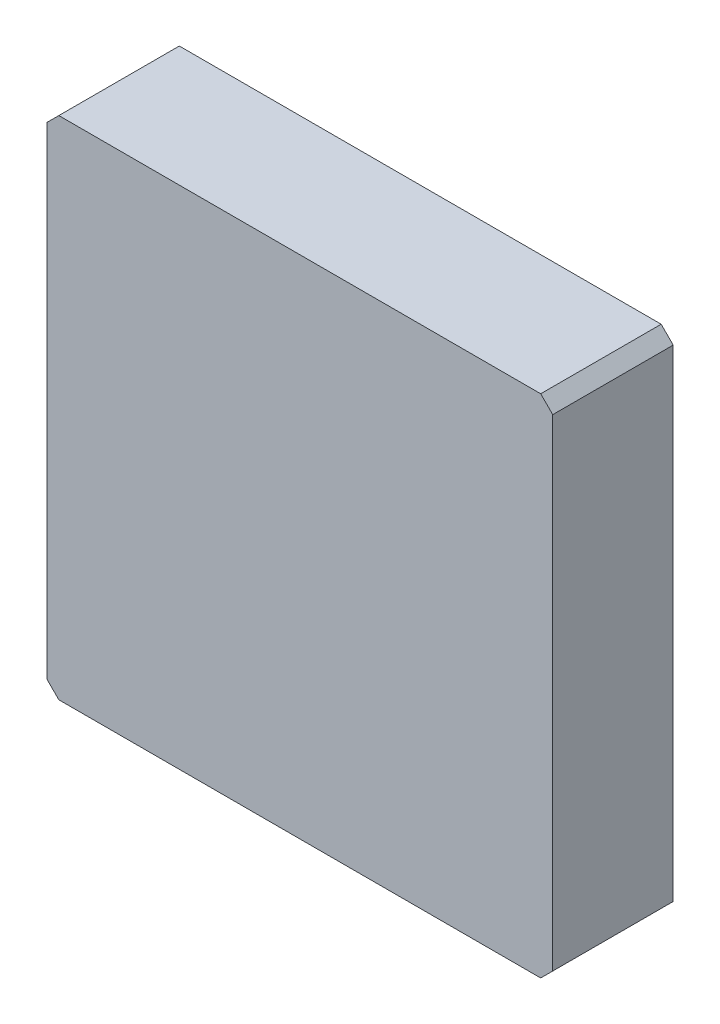
ISO-10303-21;
HEADER;
FILE_DESCRIPTION(('STEP AP214'),'2;1');
FILE_NAME('part.step','',(''),(''),'','','');
FILE_SCHEMA(('AUTOMOTIVE_DESIGN { 1 0 10303 214 1 1 1 1 }'));
ENDSEC;
DATA;
#1=APPLICATION_CONTEXT('core data for automotive mechanical design processes');
#2=APPLICATION_PROTOCOL_DEFINITION('international standard','automotive_design',2000,#1);
#3=PRODUCT_CONTEXT('',#1,'mechanical');
#4=PRODUCT('Part','Part','',(#3));
#5=PRODUCT_RELATED_PRODUCT_CATEGORY('part','',(#4));
#6=PRODUCT_DEFINITION_FORMATION('','',#4);
#7=PRODUCT_DEFINITION_CONTEXT('part definition',#1,'design');
#8=PRODUCT_DEFINITION('design','',#6,#7);
#9=PRODUCT_DEFINITION_SHAPE('','',#8);
#10=(LENGTH_UNIT() NAMED_UNIT(*) SI_UNIT(.MILLI.,.METRE.));
#11=(NAMED_UNIT(*) PLANE_ANGLE_UNIT() SI_UNIT($,.RADIAN.));
#12=(NAMED_UNIT(*) SI_UNIT($,.STERADIAN.) SOLID_ANGLE_UNIT());
#13=UNCERTAINTY_MEASURE_WITH_UNIT(LENGTH_MEASURE(1.E-05),#10,'distance_accuracy_value','');
#14=(GEOMETRIC_REPRESENTATION_CONTEXT(3) GLOBAL_UNCERTAINTY_ASSIGNED_CONTEXT((#13)) GLOBAL_UNIT_ASSIGNED_CONTEXT((#10,
#11,#12)) REPRESENTATION_CONTEXT('',''));
#15=CARTESIAN_POINT('',(0.,0.,0.));
#16=DIRECTION('',(0.,0.,1.));
#17=DIRECTION('',(1.,0.,0.));
#18=AXIS2_PLACEMENT_3D('',#15,#16,#17);
#19=CARTESIAN_POINT('',(-20.,21.,10.));
#20=DIRECTION('',(0.,-1.,0.));
#21=DIRECTION('',(1.,0.,0.));
#22=AXIS2_PLACEMENT_3D('',#19,#20,#21);
#23=PLANE('',#22);
#24=DIRECTION('',(-1.,0.,0.));
#25=VECTOR('',#24,1.);
#26=CARTESIAN_POINT('',(-20.,21.,0.));
#27=LINE('',#26,#25);
#28=CARTESIAN_POINT('',(20.,21.,0.));
#29=VERTEX_POINT('',#28);
#30=CARTESIAN_POINT('',(-20.,21.,0.));
#31=VERTEX_POINT('',#30);
#32=EDGE_CURVE('E128',#29,#31,#27,.T.);
#33=ORIENTED_EDGE('',*,*,#32,.T.);
#34=DIRECTION('',(0.,0.,-1.));
#35=VECTOR('',#34,1.);
#36=CARTESIAN_POINT('',(-20.,21.,10.));
#37=LINE('',#36,#35);
#38=CARTESIAN_POINT('',(-20.,21.,10.));
#39=VERTEX_POINT('',#38);
#40=EDGE_CURVE('E11',#39,#31,#37,.T.);
#41=ORIENTED_EDGE('',*,*,#40,.F.);
#42=DIRECTION('',(-1.,0.,0.));
#43=VECTOR('',#42,1.);
#44=CARTESIAN_POINT('',(-20.,21.,10.));
#45=LINE('',#44,#43);
#46=CARTESIAN_POINT('',(20.,21.,10.));
#47=VERTEX_POINT('',#46);
#48=EDGE_CURVE('E142',#47,#39,#45,.T.);
#49=ORIENTED_EDGE('',*,*,#48,.F.);
#50=DIRECTION('',(0.,0.,-1.));
#51=VECTOR('',#50,1.);
#52=CARTESIAN_POINT('',(20.,21.,10.));
#53=LINE('',#52,#51);
#54=EDGE_CURVE('E124',#47,#29,#53,.T.);
#55=ORIENTED_EDGE('',*,*,#54,.T.);
#56=EDGE_LOOP('',(#33,#41,#49,#55));
#57=FACE_BOUND('',#56,.T.);
#58=ADVANCED_FACE('F32',(#57),#23,.F.);
#59=CARTESIAN_POINT('',(-21.,20.,10.));
#60=DIRECTION('',(0.707106781186548,-0.707106781186548,0.));
#61=DIRECTION('',(0.707106781186548,0.707106781186548,0.));
#62=AXIS2_PLACEMENT_3D('',#59,#60,#61);
#63=PLANE('',#62);
#64=DIRECTION('',(-0.707106781186547,-0.707106781186547,0.));
#65=VECTOR('',#64,1.);
#66=CARTESIAN_POINT('',(-21.,20.,0.));
#67=LINE('',#66,#65);
#68=CARTESIAN_POINT('',(-21.,20.,0.));
#69=VERTEX_POINT('',#68);
#70=EDGE_CURVE('E131',#31,#69,#67,.T.);
#71=ORIENTED_EDGE('',*,*,#70,.T.);
#72=DIRECTION('',(0.,0.,-1.));
#73=VECTOR('',#72,1.);
#74=CARTESIAN_POINT('',(-21.,20.,10.));
#75=LINE('',#74,#73);
#76=CARTESIAN_POINT('',(-21.,20.,10.));
#77=VERTEX_POINT('',#76);
#78=EDGE_CURVE('E40',#77,#69,#75,.T.);
#79=ORIENTED_EDGE('',*,*,#78,.F.);
#80=DIRECTION('',(-0.707106781186547,-0.707106781186547,0.));
#81=VECTOR('',#80,1.);
#82=CARTESIAN_POINT('',(-21.,20.,10.));
#83=LINE('',#82,#81);
#84=EDGE_CURVE('E91',#39,#77,#83,.T.);
#85=ORIENTED_EDGE('',*,*,#84,.F.);
#86=ORIENTED_EDGE('',*,*,#40,.T.);
#87=EDGE_LOOP('',(#71,#79,#85,#86));
#88=FACE_BOUND('',#87,.T.);
#89=ADVANCED_FACE('F177',(#88),#63,.F.);
#90=CARTESIAN_POINT('',(-21.,20.,10.));
#91=DIRECTION('',(1.,0.,0.));
#92=DIRECTION('',(0.,1.,0.));
#93=AXIS2_PLACEMENT_3D('',#90,#91,#92);
#94=PLANE('',#93);
#95=DIRECTION('',(0.,-1.,0.));
#96=VECTOR('',#95,1.);
#97=CARTESIAN_POINT('',(-21.,20.,0.));
#98=LINE('',#97,#96);
#99=CARTESIAN_POINT('',(-21.,-20.,0.));
#100=VERTEX_POINT('',#99);
#101=EDGE_CURVE('E133',#69,#100,#98,.T.);
#102=ORIENTED_EDGE('',*,*,#101,.T.);
#103=DIRECTION('',(0.,0.,-1.));
#104=VECTOR('',#103,1.);
#105=CARTESIAN_POINT('',(-21.,-20.,10.));
#106=LINE('',#105,#104);
#107=CARTESIAN_POINT('',(-21.,-20.,10.));
#108=VERTEX_POINT('',#107);
#109=EDGE_CURVE('E149',#108,#100,#106,.T.);
#110=ORIENTED_EDGE('',*,*,#109,.F.);
#111=DIRECTION('',(0.,-1.,0.));
#112=VECTOR('',#111,1.);
#113=CARTESIAN_POINT('',(-21.,20.,10.));
#114=LINE('',#113,#112);
#115=EDGE_CURVE('E157',#77,#108,#114,.T.);
#116=ORIENTED_EDGE('',*,*,#115,.F.);
#117=ORIENTED_EDGE('',*,*,#78,.T.);
#118=EDGE_LOOP('',(#102,#110,#116,#117));
#119=FACE_BOUND('',#118,.T.);
#120=ADVANCED_FACE('F155',(#119),#94,.F.);
#121=CARTESIAN_POINT('',(-21.,-20.,10.));
#122=DIRECTION('',(0.707106781186548,0.707106781186548,0.));
#123=DIRECTION('',(-0.707106781186548,0.707106781186548,0.));
#124=AXIS2_PLACEMENT_3D('',#121,#122,#123);
#125=PLANE('',#124);
#126=DIRECTION('',(0.707106781186547,-0.707106781186547,0.));
#127=VECTOR('',#126,1.);
#128=CARTESIAN_POINT('',(-21.,-20.,0.));
#129=LINE('',#128,#127);
#130=CARTESIAN_POINT('',(-20.,-21.,0.));
#131=VERTEX_POINT('',#130);
#132=EDGE_CURVE('E135',#100,#131,#129,.T.);
#133=ORIENTED_EDGE('',*,*,#132,.T.);
#134=DIRECTION('',(0.,0.,-1.));
#135=VECTOR('',#134,1.);
#136=CARTESIAN_POINT('',(-20.,-21.,10.));
#137=LINE('',#136,#135);
#138=CARTESIAN_POINT('',(-20.,-21.,10.));
#139=VERTEX_POINT('',#138);
#140=EDGE_CURVE('E146',#139,#131,#137,.T.);
#141=ORIENTED_EDGE('',*,*,#140,.F.);
#142=DIRECTION('',(0.707106781186547,-0.707106781186547,0.));
#143=VECTOR('',#142,1.);
#144=CARTESIAN_POINT('',(-21.,-20.,10.));
#145=LINE('',#144,#143);
#146=EDGE_CURVE('E169',#108,#139,#145,.T.);
#147=ORIENTED_EDGE('',*,*,#146,.F.);
#148=ORIENTED_EDGE('',*,*,#109,.T.);
#149=EDGE_LOOP('',(#133,#141,#147,#148));
#150=FACE_BOUND('',#149,.T.);
#151=ADVANCED_FACE('F165',(#150),#125,.F.);
#152=CARTESIAN_POINT('',(-20.,-21.,10.));
#153=DIRECTION('',(0.,1.,0.));
#154=DIRECTION('',(0.,0.,1.));
#155=AXIS2_PLACEMENT_3D('',#152,#153,#154);
#156=PLANE('',#155);
#157=DIRECTION('',(1.,0.,0.));
#158=VECTOR('',#157,1.);
#159=CARTESIAN_POINT('',(-20.,-21.,0.));
#160=LINE('',#159,#158);
#161=CARTESIAN_POINT('',(20.,-21.,0.));
#162=VERTEX_POINT('',#161);
#163=EDGE_CURVE('E137',#131,#162,#160,.T.);
#164=ORIENTED_EDGE('',*,*,#163,.T.);
#165=DIRECTION('',(0.,0.,-1.));
#166=VECTOR('',#165,1.);
#167=CARTESIAN_POINT('',(20.,-21.,10.));
#168=LINE('',#167,#166);
#169=CARTESIAN_POINT('',(20.,-21.,10.));
#170=VERTEX_POINT('',#169);
#171=EDGE_CURVE('E119',#170,#162,#168,.T.);
#172=ORIENTED_EDGE('',*,*,#171,.F.);
#173=DIRECTION('',(1.,0.,0.));
#174=VECTOR('',#173,1.);
#175=CARTESIAN_POINT('',(-20.,-21.,10.));
#176=LINE('',#175,#174);
#177=EDGE_CURVE('E110',#139,#170,#176,.T.);
#178=ORIENTED_EDGE('',*,*,#177,.F.);
#179=ORIENTED_EDGE('',*,*,#140,.T.);
#180=EDGE_LOOP('',(#164,#172,#178,#179));
#181=FACE_BOUND('',#180,.T.);
#182=ADVANCED_FACE('F168',(#181),#156,.F.);
#183=CARTESIAN_POINT('',(21.,-20.,10.));
#184=DIRECTION('',(-0.707106781186548,0.707106781186548,0.));
#185=DIRECTION('',(-0.707106781186548,-0.707106781186548,0.));
#186=AXIS2_PLACEMENT_3D('',#183,#184,#185);
#187=PLANE('',#186);
#188=DIRECTION('',(0.707106781186547,0.707106781186547,0.));
#189=VECTOR('',#188,1.);
#190=CARTESIAN_POINT('',(21.,-20.,0.));
#191=LINE('',#190,#189);
#192=CARTESIAN_POINT('',(21.,-20.,0.));
#193=VERTEX_POINT('',#192);
#194=EDGE_CURVE('E118',#162,#193,#191,.T.);
#195=ORIENTED_EDGE('',*,*,#194,.T.);
#196=DIRECTION('',(0.,0.,-1.));
#197=VECTOR('',#196,1.);
#198=CARTESIAN_POINT('',(21.,-20.,10.));
#199=LINE('',#198,#197);
#200=CARTESIAN_POINT('',(21.,-20.,10.));
#201=VERTEX_POINT('',#200);
#202=EDGE_CURVE('E115',#201,#193,#199,.T.);
#203=ORIENTED_EDGE('',*,*,#202,.F.);
#204=DIRECTION('',(0.707106781186547,0.707106781186547,0.));
#205=VECTOR('',#204,1.);
#206=CARTESIAN_POINT('',(21.,-20.,10.));
#207=LINE('',#206,#205);
#208=EDGE_CURVE('E104',#170,#201,#207,.T.);
#209=ORIENTED_EDGE('',*,*,#208,.F.);
#210=ORIENTED_EDGE('',*,*,#171,.T.);
#211=EDGE_LOOP('',(#195,#203,#209,#210));
#212=FACE_BOUND('',#211,.T.);
#213=ADVANCED_FACE('F116',(#212),#187,.F.);
#214=CARTESIAN_POINT('',(21.,20.,10.));
#215=DIRECTION('',(-1.,0.,0.));
#216=DIRECTION('',(0.,-1.,0.));
#217=AXIS2_PLACEMENT_3D('',#214,#215,#216);
#218=PLANE('',#217);
#219=DIRECTION('',(0.,1.,0.));
#220=VECTOR('',#219,1.);
#221=CARTESIAN_POINT('',(21.,20.,0.));
#222=LINE('',#221,#220);
#223=CARTESIAN_POINT('',(21.,20.,0.));
#224=VERTEX_POINT('',#223);
#225=EDGE_CURVE('E77',#193,#224,#222,.T.);
#226=ORIENTED_EDGE('',*,*,#225,.T.);
#227=DIRECTION('',(0.,0.,-1.));
#228=VECTOR('',#227,1.);
#229=CARTESIAN_POINT('',(21.,20.,10.));
#230=LINE('',#229,#228);
#231=CARTESIAN_POINT('',(21.,20.,10.));
#232=VERTEX_POINT('',#231);
#233=EDGE_CURVE('E120',#232,#224,#230,.T.);
#234=ORIENTED_EDGE('',*,*,#233,.F.);
#235=DIRECTION('',(0.,1.,0.));
#236=VECTOR('',#235,1.);
#237=CARTESIAN_POINT('',(21.,20.,10.));
#238=LINE('',#237,#236);
#239=EDGE_CURVE('E108',#201,#232,#238,.T.);
#240=ORIENTED_EDGE('',*,*,#239,.F.);
#241=ORIENTED_EDGE('',*,*,#202,.T.);
#242=EDGE_LOOP('',(#226,#234,#240,#241));
#243=FACE_BOUND('',#242,.T.);
#244=ADVANCED_FACE('F122',(#243),#218,.F.);
#245=CARTESIAN_POINT('',(20.,21.,10.));
#246=DIRECTION('',(-0.707106781186549,-0.707106781186546,0.));
#247=DIRECTION('',(0.707106781186546,-0.707106781186549,0.));
#248=AXIS2_PLACEMENT_3D('',#245,#246,#247);
#249=PLANE('',#248);
#250=DIRECTION('',(-0.707106781186546,0.707106781186549,0.));
#251=VECTOR('',#250,1.);
#252=CARTESIAN_POINT('',(20.,21.,0.));
#253=LINE('',#252,#251);
#254=EDGE_CURVE('E83',#224,#29,#253,.T.);
#255=ORIENTED_EDGE('',*,*,#254,.T.);
#256=ORIENTED_EDGE('',*,*,#54,.F.);
#257=DIRECTION('',(-0.707106781186546,0.707106781186549,0.));
#258=VECTOR('',#257,1.);
#259=CARTESIAN_POINT('',(20.,21.,10.));
#260=LINE('',#259,#258);
#261=EDGE_CURVE('E48',#232,#47,#260,.T.);
#262=ORIENTED_EDGE('',*,*,#261,.F.);
#263=ORIENTED_EDGE('',*,*,#233,.T.);
#264=EDGE_LOOP('',(#255,#256,#262,#263));
#265=FACE_BOUND('',#264,.T.);
#266=ADVANCED_FACE('F193',(#265),#249,.F.);
#267=CARTESIAN_POINT('',(0.,0.,10.));
#268=DIRECTION('',(0.,0.,-1.));
#269=DIRECTION('',(-1.,0.,0.));
#270=AXIS2_PLACEMENT_3D('',#267,#268,#269);
#271=PLANE('',#270);
#272=ORIENTED_EDGE('',*,*,#48,.T.);
#273=ORIENTED_EDGE('',*,*,#84,.T.);
#274=ORIENTED_EDGE('',*,*,#115,.T.);
#275=ORIENTED_EDGE('',*,*,#146,.T.);
#276=ORIENTED_EDGE('',*,*,#177,.T.);
#277=ORIENTED_EDGE('',*,*,#208,.T.);
#278=ORIENTED_EDGE('',*,*,#239,.T.);
#279=ORIENTED_EDGE('',*,*,#261,.T.);
#280=EDGE_LOOP('',(#272,#273,#274,#275,#276,#277,#278,#279));
#281=FACE_BOUND('',#280,.T.);
#282=ADVANCED_FACE('F106',(#281),#271,.F.);
#283=CARTESIAN_POINT('',(0.,0.,0.));
#284=DIRECTION('',(0.,0.,-1.));
#285=DIRECTION('',(-1.,0.,0.));
#286=AXIS2_PLACEMENT_3D('',#283,#284,#285);
#287=PLANE('',#286);
#288=ORIENTED_EDGE('',*,*,#32,.F.);
#289=ORIENTED_EDGE('',*,*,#254,.F.);
#290=ORIENTED_EDGE('',*,*,#225,.F.);
#291=ORIENTED_EDGE('',*,*,#194,.F.);
#292=ORIENTED_EDGE('',*,*,#163,.F.);
#293=ORIENTED_EDGE('',*,*,#132,.F.);
#294=ORIENTED_EDGE('',*,*,#101,.F.);
#295=ORIENTED_EDGE('',*,*,#70,.F.);
#296=EDGE_LOOP('',(#288,#289,#290,#291,#292,#293,#294,#295));
#297=FACE_BOUND('',#296,.T.);
#298=ADVANCED_FACE('F161',(#297),#287,.T.);
#299=CLOSED_SHELL('',(#58,#89,#120,#151,#182,#213,#244,#266,#282,#298));
#300=MANIFOLD_SOLID_BREP('B2',#299);
#301=ADVANCED_BREP_SHAPE_REPRESENTATION('',(#18,#300),#14);
#302=SHAPE_DEFINITION_REPRESENTATION(#9,#301);
ENDSEC;
END-ISO-10303-21;
